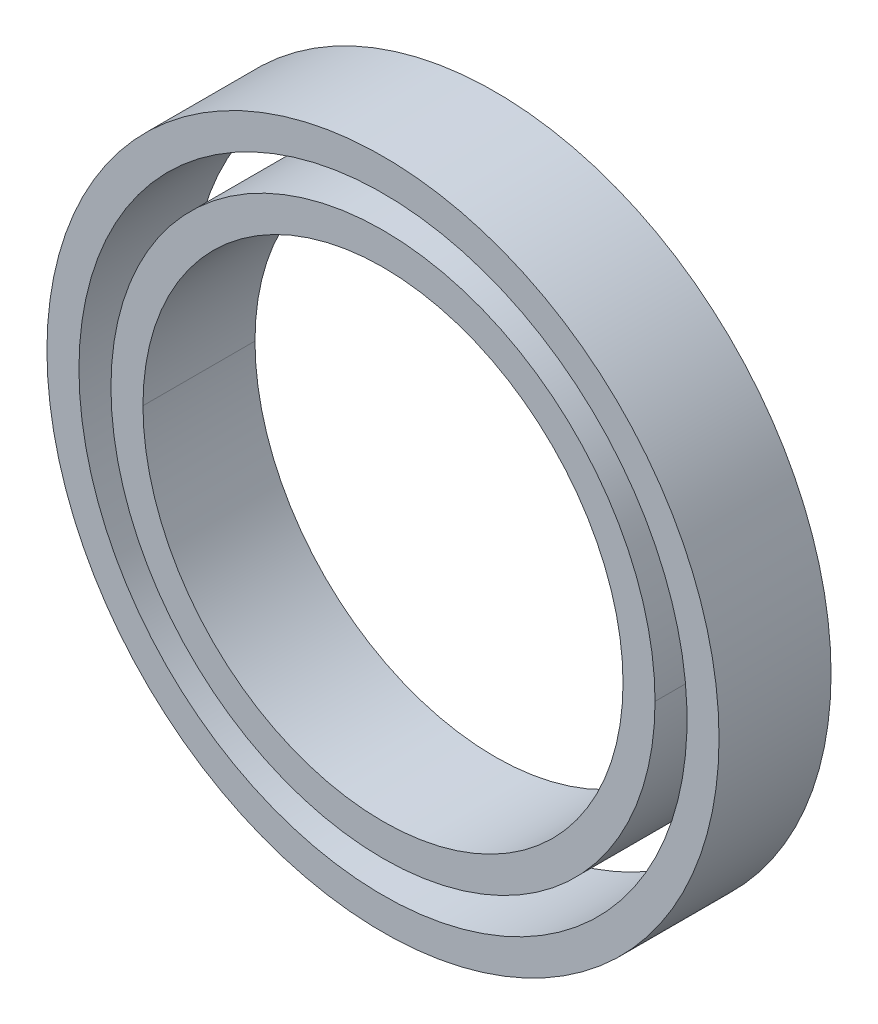
ISO-10303-21;
HEADER;
FILE_DESCRIPTION(('STEP AP214'),'2;1');
FILE_NAME('part.step','',(''),(''),'','','');
FILE_SCHEMA(('AUTOMOTIVE_DESIGN { 1 0 10303 214 1 1 1 1 }'));
ENDSEC;
DATA;
#1=APPLICATION_CONTEXT('core data for automotive mechanical design processes');
#2=APPLICATION_PROTOCOL_DEFINITION('international standard','automotive_design',2000,#1);
#3=PRODUCT_CONTEXT('',#1,'mechanical');
#4=PRODUCT('Part','Part','',(#3));
#5=PRODUCT_RELATED_PRODUCT_CATEGORY('part','',(#4));
#6=PRODUCT_DEFINITION_FORMATION('','',#4);
#7=PRODUCT_DEFINITION_CONTEXT('part definition',#1,'design');
#8=PRODUCT_DEFINITION('design','',#6,#7);
#9=PRODUCT_DEFINITION_SHAPE('','',#8);
#10=(LENGTH_UNIT() NAMED_UNIT(*) SI_UNIT(.MILLI.,.METRE.));
#11=(NAMED_UNIT(*) PLANE_ANGLE_UNIT() SI_UNIT($,.RADIAN.));
#12=(NAMED_UNIT(*) SI_UNIT($,.STERADIAN.) SOLID_ANGLE_UNIT());
#13=UNCERTAINTY_MEASURE_WITH_UNIT(LENGTH_MEASURE(1.E-05),#10,'distance_accuracy_value','');
#14=(GEOMETRIC_REPRESENTATION_CONTEXT(3) GLOBAL_UNCERTAINTY_ASSIGNED_CONTEXT((#13)) GLOBAL_UNIT_ASSIGNED_CONTEXT((#10,
#11,#12)) REPRESENTATION_CONTEXT('',''));
#15=CARTESIAN_POINT('',(0.,0.,0.));
#16=DIRECTION('',(0.,0.,1.));
#17=DIRECTION('',(1.,0.,0.));
#18=AXIS2_PLACEMENT_3D('',#15,#16,#17);
#19=CARTESIAN_POINT('',(0.,0.,7.));
#20=DIRECTION('',(0.,0.,-1.));
#21=DIRECTION('',(-1.,0.,0.));
#22=AXIS2_PLACEMENT_3D('',#19,#20,#21);
#23=CYLINDRICAL_SURFACE('',#22,21.);
#24=CARTESIAN_POINT('',(0.,0.,7.));
#25=DIRECTION('',(0.,0.,-1.));
#26=DIRECTION('',(-1.,0.,0.));
#27=AXIS2_PLACEMENT_3D('',#24,#25,#26);
#28=CIRCLE('',#27,21.);
#29=CARTESIAN_POINT('',(-21.,0.,7.));
#30=VERTEX_POINT('',#29);
#31=EDGE_CURVE('P0_E10',#30,#30,#28,.T.);
#32=ORIENTED_EDGE('',*,*,#31,.T.);
#33=EDGE_LOOP('',(#32));
#34=FACE_BOUND('',#33,.T.);
#35=CARTESIAN_POINT('',(0.,0.,0.));
#36=DIRECTION('',(0.,0.,-1.));
#37=DIRECTION('',(-1.,0.,0.));
#38=AXIS2_PLACEMENT_3D('',#35,#36,#37);
#39=CIRCLE('',#38,21.);
#40=CARTESIAN_POINT('',(-21.,0.,0.));
#41=VERTEX_POINT('',#40);
#42=EDGE_CURVE('P0_E45',#41,#41,#39,.T.);
#43=ORIENTED_EDGE('',*,*,#42,.F.);
#44=EDGE_LOOP('',(#43));
#45=FACE_BOUND('',#44,.T.);
#46=ADVANCED_FACE('P0_F31',(#34,#45),#23,.T.);
#47=CARTESIAN_POINT('',(21.,0.,7.));
#48=DIRECTION('',(0.,0.,1.));
#49=DIRECTION('',(1.,0.,0.));
#50=AXIS2_PLACEMENT_3D('',#47,#48,#49);
#51=PLANE('',#50);
#52=CARTESIAN_POINT('',(0.,0.,7.));
#53=DIRECTION('',(0.,0.,-1.));
#54=DIRECTION('',(-1.,0.,0.));
#55=AXIS2_PLACEMENT_3D('',#52,#53,#54);
#56=CIRCLE('',#55,19.);
#57=CARTESIAN_POINT('',(-19.,0.,7.));
#58=VERTEX_POINT('',#57);
#59=EDGE_CURVE('P0_E37',#58,#58,#56,.T.);
#60=ORIENTED_EDGE('',*,*,#59,.T.);
#61=EDGE_LOOP('',(#60));
#62=FACE_BOUND('',#61,.T.);
#63=ORIENTED_EDGE('',*,*,#31,.F.);
#64=EDGE_LOOP('',(#63));
#65=FACE_BOUND('',#64,.T.);
#66=ADVANCED_FACE('P0_F55',(#62,#65),#51,.T.);
#67=CARTESIAN_POINT('',(0.,0.,7.));
#68=DIRECTION('',(0.,0.,-1.));
#69=DIRECTION('',(-1.,0.,0.));
#70=AXIS2_PLACEMENT_3D('',#67,#68,#69);
#71=CYLINDRICAL_SURFACE('',#70,19.);
#72=CARTESIAN_POINT('',(0.,0.,0.));
#73=DIRECTION('',(0.,0.,-1.));
#74=DIRECTION('',(-1.,0.,0.));
#75=AXIS2_PLACEMENT_3D('',#72,#73,#74);
#76=CIRCLE('',#75,19.);
#77=CARTESIAN_POINT('',(-19.,0.,0.));
#78=VERTEX_POINT('',#77);
#79=EDGE_CURVE('P0_E41',#78,#78,#76,.T.);
#80=ORIENTED_EDGE('',*,*,#79,.T.);
#81=EDGE_LOOP('',(#80));
#82=FACE_BOUND('',#81,.T.);
#83=ORIENTED_EDGE('',*,*,#59,.F.);
#84=EDGE_LOOP('',(#83));
#85=FACE_BOUND('',#84,.T.);
#86=ADVANCED_FACE('P0_F59',(#82,#85),#71,.F.);
#87=CARTESIAN_POINT('',(19.,0.,0.));
#88=DIRECTION('',(0.,0.,-1.));
#89=DIRECTION('',(-1.,0.,0.));
#90=AXIS2_PLACEMENT_3D('',#87,#88,#89);
#91=PLANE('',#90);
#92=ORIENTED_EDGE('',*,*,#42,.T.);
#93=EDGE_LOOP('',(#92));
#94=FACE_BOUND('',#93,.T.);
#95=ORIENTED_EDGE('',*,*,#79,.F.);
#96=EDGE_LOOP('',(#95));
#97=FACE_BOUND('',#96,.T.);
#98=ADVANCED_FACE('P0_F51',(#94,#97),#91,.T.);
#99=CLOSED_SHELL('',(#46,#66,#86,#98));
#100=MANIFOLD_SOLID_BREP('P0_B2',#99);
#101=CARTESIAN_POINT('',(0.,0.,0.));
#102=DIRECTION('',(0.,0.,1.));
#103=DIRECTION('',(1.,0.,0.));
#104=AXIS2_PLACEMENT_3D('',#101,#102,#103);
#105=PLANE('',#104);
#106=CARTESIAN_POINT('',(0.,0.,0.));
#107=DIRECTION('',(0.,0.,1.));
#108=DIRECTION('',(1.,0.,0.));
#109=AXIS2_PLACEMENT_3D('',#106,#107,#108);
#110=CIRCLE('',#109,15.);
#111=CARTESIAN_POINT('',(-15.,0.,0.));
#112=VERTEX_POINT('',#111);
#113=CARTESIAN_POINT('',(15.,0.,0.));
#114=VERTEX_POINT('',#113);
#115=EDGE_CURVE('P1_E115',#112,#114,#110,.T.);
#116=ORIENTED_EDGE('',*,*,#115,.T.);
#117=CARTESIAN_POINT('',(0.,0.,0.));
#118=DIRECTION('',(0.,0.,1.));
#119=DIRECTION('',(1.,0.,0.));
#120=AXIS2_PLACEMENT_3D('',#117,#118,#119);
#121=CIRCLE('',#120,15.);
#122=EDGE_CURVE('P1_E44',#114,#112,#121,.T.);
#123=ORIENTED_EDGE('',*,*,#122,.T.);
#124=EDGE_LOOP('',(#116,#123));
#125=FACE_BOUND('',#124,.T.);
#126=CARTESIAN_POINT('',(0.,0.,0.));
#127=DIRECTION('',(0.,0.,1.));
#128=DIRECTION('',(1.,0.,0.));
#129=AXIS2_PLACEMENT_3D('',#126,#127,#128);
#130=CIRCLE('',#129,17.);
#131=CARTESIAN_POINT('',(-17.,0.,0.));
#132=VERTEX_POINT('',#131);
#133=CARTESIAN_POINT('',(17.,0.,0.));
#134=VERTEX_POINT('',#133);
#135=EDGE_CURVE('P1_E11',#132,#134,#130,.T.);
#136=ORIENTED_EDGE('',*,*,#135,.F.);
#137=CARTESIAN_POINT('',(0.,0.,0.));
#138=DIRECTION('',(0.,0.,1.));
#139=DIRECTION('',(1.,0.,0.));
#140=AXIS2_PLACEMENT_3D('',#137,#138,#139);
#141=CIRCLE('',#140,17.);
#142=EDGE_CURVE('P1_E84',#134,#132,#141,.T.);
#143=ORIENTED_EDGE('',*,*,#142,.F.);
#144=EDGE_LOOP('',(#136,#143));
#145=FACE_BOUND('',#144,.T.);
#146=ADVANCED_FACE('P1_F19',(#125,#145),#105,.F.);
#147=CARTESIAN_POINT('',(0.,0.,7.));
#148=DIRECTION('',(0.,0.,1.));
#149=DIRECTION('',(1.,0.,0.));
#150=AXIS2_PLACEMENT_3D('',#147,#148,#149);
#151=PLANE('',#150);
#152=CARTESIAN_POINT('',(0.,0.,7.));
#153=DIRECTION('',(0.,0.,1.));
#154=DIRECTION('',(1.,0.,0.));
#155=AXIS2_PLACEMENT_3D('',#152,#153,#154);
#156=CIRCLE('',#155,15.);
#157=CARTESIAN_POINT('',(-15.,0.,7.));
#158=VERTEX_POINT('',#157);
#159=CARTESIAN_POINT('',(15.,0.,7.));
#160=VERTEX_POINT('',#159);
#161=EDGE_CURVE('P1_E86',#158,#160,#156,.T.);
#162=ORIENTED_EDGE('',*,*,#161,.F.);
#163=CARTESIAN_POINT('',(0.,0.,7.));
#164=DIRECTION('',(0.,0.,1.));
#165=DIRECTION('',(1.,0.,0.));
#166=AXIS2_PLACEMENT_3D('',#163,#164,#165);
#167=CIRCLE('',#166,15.);
#168=EDGE_CURVE('P1_E116',#160,#158,#167,.T.);
#169=ORIENTED_EDGE('',*,*,#168,.F.);
#170=EDGE_LOOP('',(#162,#169));
#171=FACE_BOUND('',#170,.T.);
#172=CARTESIAN_POINT('',(0.,0.,7.));
#173=DIRECTION('',(0.,0.,1.));
#174=DIRECTION('',(1.,0.,0.));
#175=AXIS2_PLACEMENT_3D('',#172,#173,#174);
#176=CIRCLE('',#175,17.);
#177=CARTESIAN_POINT('',(-17.,0.,7.));
#178=VERTEX_POINT('',#177);
#179=CARTESIAN_POINT('',(17.,0.,7.));
#180=VERTEX_POINT('',#179);
#181=EDGE_CURVE('P1_E31',#178,#180,#176,.T.);
#182=ORIENTED_EDGE('',*,*,#181,.T.);
#183=CARTESIAN_POINT('',(0.,0.,7.));
#184=DIRECTION('',(0.,0.,1.));
#185=DIRECTION('',(1.,0.,0.));
#186=AXIS2_PLACEMENT_3D('',#183,#184,#185);
#187=CIRCLE('',#186,17.);
#188=EDGE_CURVE('P1_E23',#180,#178,#187,.T.);
#189=ORIENTED_EDGE('',*,*,#188,.T.);
#190=EDGE_LOOP('',(#182,#189));
#191=FACE_BOUND('',#190,.T.);
#192=ADVANCED_FACE('P1_F21',(#171,#191),#151,.T.);
#193=CARTESIAN_POINT('',(0.,0.,7.));
#194=DIRECTION('',(0.,0.,-1.));
#195=DIRECTION('',(-1.,0.,0.));
#196=AXIS2_PLACEMENT_3D('',#193,#194,#195);
#197=CYLINDRICAL_SURFACE('',#196,17.);
#198=DIRECTION('',(0.,0.,-1.));
#199=VECTOR('',#198,1.);
#200=CARTESIAN_POINT('',(17.,0.,7.));
#201=LINE('',#200,#199);
#202=EDGE_CURVE('P1_E76',#180,#134,#201,.T.);
#203=ORIENTED_EDGE('',*,*,#202,.F.);
#204=ORIENTED_EDGE('',*,*,#181,.F.);
#205=DIRECTION('',(0.,0.,-1.));
#206=VECTOR('',#205,1.);
#207=CARTESIAN_POINT('',(-17.,0.,7.));
#208=LINE('',#207,#206);
#209=EDGE_CURVE('P1_E73',#178,#132,#208,.T.);
#210=ORIENTED_EDGE('',*,*,#209,.T.);
#211=ORIENTED_EDGE('',*,*,#135,.T.);
#212=EDGE_LOOP('',(#203,#204,#210,#211));
#213=FACE_BOUND('',#212,.T.);
#214=ADVANCED_FACE('P1_F72',(#213),#197,.T.);
#215=CARTESIAN_POINT('',(0.,0.,7.));
#216=DIRECTION('',(0.,0.,-1.));
#217=DIRECTION('',(-1.,0.,0.));
#218=AXIS2_PLACEMENT_3D('',#215,#216,#217);
#219=CYLINDRICAL_SURFACE('',#218,15.);
#220=DIRECTION('',(0.,0.,-1.));
#221=VECTOR('',#220,1.);
#222=CARTESIAN_POINT('',(15.,0.,7.));
#223=LINE('',#222,#221);
#224=EDGE_CURVE('P1_E111',#160,#114,#223,.T.);
#225=ORIENTED_EDGE('',*,*,#224,.F.);
#226=ORIENTED_EDGE('',*,*,#168,.T.);
#227=DIRECTION('',(0.,0.,-1.));
#228=VECTOR('',#227,1.);
#229=CARTESIAN_POINT('',(-15.,0.,7.));
#230=LINE('',#229,#228);
#231=EDGE_CURVE('P1_E124',#158,#112,#230,.T.);
#232=ORIENTED_EDGE('',*,*,#231,.T.);
#233=ORIENTED_EDGE('',*,*,#122,.F.);
#234=EDGE_LOOP('',(#225,#226,#232,#233));
#235=FACE_BOUND('',#234,.T.);
#236=ADVANCED_FACE('P1_F157',(#235),#219,.F.);
#237=CARTESIAN_POINT('',(0.,0.,7.));
#238=DIRECTION('',(0.,0.,-1.));
#239=DIRECTION('',(-1.,0.,0.));
#240=AXIS2_PLACEMENT_3D('',#237,#238,#239);
#241=CYLINDRICAL_SURFACE('',#240,15.);
#242=ORIENTED_EDGE('',*,*,#161,.T.);
#243=ORIENTED_EDGE('',*,*,#224,.T.);
#244=ORIENTED_EDGE('',*,*,#115,.F.);
#245=ORIENTED_EDGE('',*,*,#231,.F.);
#246=EDGE_LOOP('',(#242,#243,#244,#245));
#247=FACE_BOUND('',#246,.T.);
#248=ADVANCED_FACE('P1_F155',(#247),#241,.F.);
#249=CARTESIAN_POINT('',(0.,0.,7.));
#250=DIRECTION('',(0.,0.,-1.));
#251=DIRECTION('',(-1.,0.,0.));
#252=AXIS2_PLACEMENT_3D('',#249,#250,#251);
#253=CYLINDRICAL_SURFACE('',#252,17.);
#254=ORIENTED_EDGE('',*,*,#188,.F.);
#255=ORIENTED_EDGE('',*,*,#202,.T.);
#256=ORIENTED_EDGE('',*,*,#142,.T.);
#257=ORIENTED_EDGE('',*,*,#209,.F.);
#258=EDGE_LOOP('',(#254,#255,#256,#257));
#259=FACE_BOUND('',#258,.T.);
#260=ADVANCED_FACE('P1_F82',(#259),#253,.T.);
#261=CLOSED_SHELL('',(#146,#192,#214,#236,#248,#260));
#262=MANIFOLD_SOLID_BREP('P1_B1',#261);
#263=ADVANCED_BREP_SHAPE_REPRESENTATION('',(#18,#100,#262),#14);
#264=SHAPE_DEFINITION_REPRESENTATION(#9,#263);
ENDSEC;
END-ISO-10303-21;
